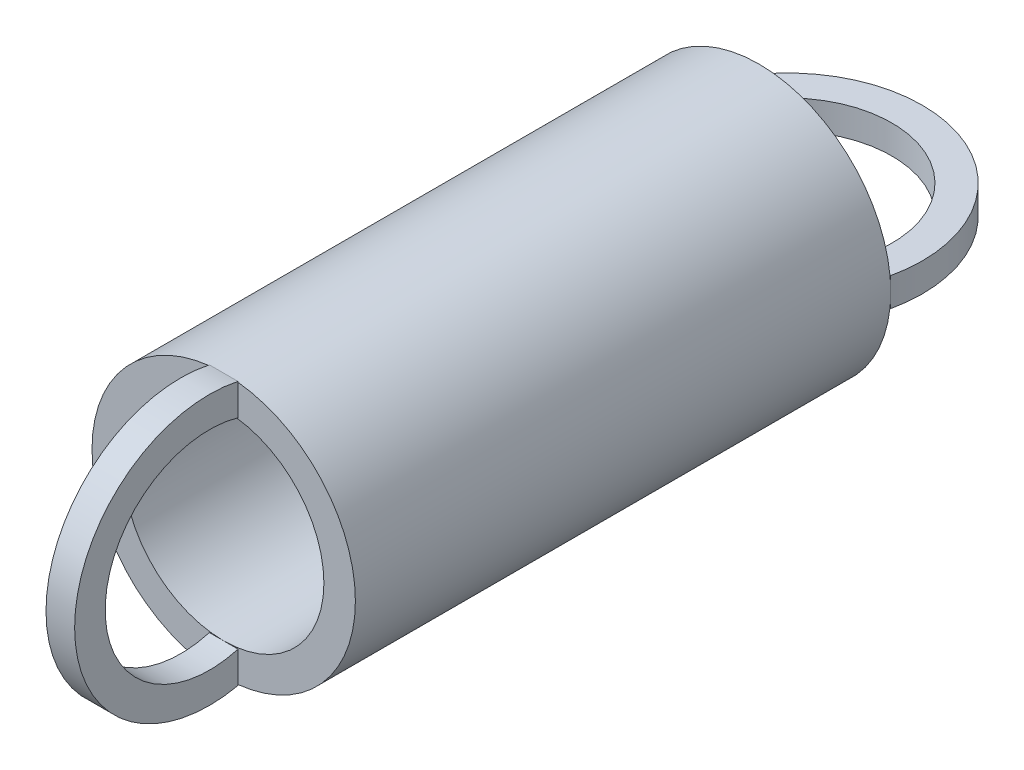
ISO-10303-21;
HEADER;
FILE_DESCRIPTION(('STEP AP214'),'2;1');
FILE_NAME('part.step','',(''),(''),'','','');
FILE_SCHEMA(('AUTOMOTIVE_DESIGN { 1 0 10303 214 1 1 1 1 }'));
ENDSEC;
DATA;
#1=APPLICATION_CONTEXT('core data for automotive mechanical design processes');
#2=APPLICATION_PROTOCOL_DEFINITION('international standard','automotive_design',2000,#1);
#3=PRODUCT_CONTEXT('',#1,'mechanical');
#4=PRODUCT('Part','Part','',(#3));
#5=PRODUCT_RELATED_PRODUCT_CATEGORY('part','',(#4));
#6=PRODUCT_DEFINITION_FORMATION('','',#4);
#7=PRODUCT_DEFINITION_CONTEXT('part definition',#1,'design');
#8=PRODUCT_DEFINITION('design','',#6,#7);
#9=PRODUCT_DEFINITION_SHAPE('','',#8);
#10=(LENGTH_UNIT() NAMED_UNIT(*) SI_UNIT(.MILLI.,.METRE.));
#11=(NAMED_UNIT(*) PLANE_ANGLE_UNIT() SI_UNIT($,.RADIAN.));
#12=(NAMED_UNIT(*) SI_UNIT($,.STERADIAN.) SOLID_ANGLE_UNIT());
#13=UNCERTAINTY_MEASURE_WITH_UNIT(LENGTH_MEASURE(1.E-05),#10,'distance_accuracy_value','');
#14=(GEOMETRIC_REPRESENTATION_CONTEXT(3) GLOBAL_UNCERTAINTY_ASSIGNED_CONTEXT((#13)) GLOBAL_UNIT_ASSIGNED_CONTEXT((#10,
#11,#12)) REPRESENTATION_CONTEXT('',''));
#15=CARTESIAN_POINT('',(0.,0.,0.));
#16=DIRECTION('',(0.,0.,1.));
#17=DIRECTION('',(1.,0.,0.));
#18=AXIS2_PLACEMENT_3D('',#15,#16,#17);
#19=CARTESIAN_POINT('',(0.,0.,-9.35));
#20=DIRECTION('',(0.,0.,1.));
#21=DIRECTION('',(1.,0.,0.));
#22=AXIS2_PLACEMENT_3D('',#19,#20,#21);
#23=PLANE('',#22);
#24=DIRECTION('',(1.,0.,0.));
#25=VECTOR('',#24,1.);
#26=CARTESIAN_POINT('',(-3.5,0.5,-9.35));
#27=LINE('',#26,#25);
#28=CARTESIAN_POINT('',(-4.57274534606947,0.5,-9.35));
#29=VERTEX_POINT('',#28);
#30=CARTESIAN_POINT('',(-3.5,0.5,-9.35));
#31=VERTEX_POINT('',#30);
#32=EDGE_CURVE('E164',#29,#31,#27,.T.);
#33=ORIENTED_EDGE('',*,*,#32,.F.);
#34=CARTESIAN_POINT('',(0.,0.,-9.35));
#35=DIRECTION('',(0.,0.,1.));
#36=DIRECTION('',(1.,0.,0.));
#37=AXIS2_PLACEMENT_3D('',#34,#35,#36);
#38=CIRCLE('',#37,4.6);
#39=CARTESIAN_POINT('',(4.57274534606947,0.5,-9.35));
#40=VERTEX_POINT('',#39);
#41=EDGE_CURVE('E183',#40,#29,#38,.T.);
#42=ORIENTED_EDGE('',*,*,#41,.F.);
#43=DIRECTION('',(1.,0.,0.));
#44=VECTOR('',#43,1.);
#45=CARTESIAN_POINT('',(4.6,0.5,-9.35));
#46=LINE('',#45,#44);
#47=CARTESIAN_POINT('',(3.5,0.5,-9.35));
#48=VERTEX_POINT('',#47);
#49=EDGE_CURVE('E160',#48,#40,#46,.T.);
#50=ORIENTED_EDGE('',*,*,#49,.F.);
#51=DIRECTION('',(0.,-1.,0.));
#52=VECTOR('',#51,1.);
#53=CARTESIAN_POINT('',(3.5,0.5,-9.35));
#54=LINE('',#53,#52);
#55=CARTESIAN_POINT('',(3.5,0.,-9.35));
#56=VERTEX_POINT('',#55);
#57=EDGE_CURVE('E171',#48,#56,#54,.T.);
#58=ORIENTED_EDGE('',*,*,#57,.T.);
#59=CARTESIAN_POINT('',(0.,0.,-9.35));
#60=DIRECTION('',(0.,0.,1.));
#61=DIRECTION('',(1.,0.,0.));
#62=AXIS2_PLACEMENT_3D('',#59,#60,#61);
#63=CIRCLE('',#62,3.5);
#64=CARTESIAN_POINT('',(-3.5,0.,-9.35));
#65=VERTEX_POINT('',#64);
#66=EDGE_CURVE('E298',#56,#65,#63,.T.);
#67=ORIENTED_EDGE('',*,*,#66,.T.);
#68=DIRECTION('',(0.,-1.,0.));
#69=VECTOR('',#68,1.);
#70=CARTESIAN_POINT('',(-3.5,0.5,-9.35));
#71=LINE('',#70,#69);
#72=EDGE_CURVE('E211',#31,#65,#71,.T.);
#73=ORIENTED_EDGE('',*,*,#72,.F.);
#74=EDGE_LOOP('',(#33,#42,#50,#58,#67,#73));
#75=FACE_BOUND('',#74,.T.);
#76=ADVANCED_FACE('F39',(#75),#23,.F.);
#77=CARTESIAN_POINT('',(-3.5,-0.5,-9.35));
#78=VERTEX_POINT('',#77);
#79=EDGE_CURVE('E195',#65,#78,#71,.T.);
#80=ORIENTED_EDGE('',*,*,#79,.F.);
#81=EDGE_CURVE('E291',#65,#56,#63,.T.);
#82=ORIENTED_EDGE('',*,*,#81,.T.);
#83=CARTESIAN_POINT('',(3.5,-0.5,-9.35));
#84=VERTEX_POINT('',#83);
#85=EDGE_CURVE('E175',#56,#84,#54,.T.);
#86=ORIENTED_EDGE('',*,*,#85,.T.);
#87=DIRECTION('',(1.,0.,0.));
#88=VECTOR('',#87,1.);
#89=CARTESIAN_POINT('',(4.6,-0.5,-9.35));
#90=LINE('',#89,#88);
#91=CARTESIAN_POINT('',(4.57274534606947,-0.5,-9.35));
#92=VERTEX_POINT('',#91);
#93=EDGE_CURVE('E200',#84,#92,#90,.T.);
#94=ORIENTED_EDGE('',*,*,#93,.T.);
#95=CARTESIAN_POINT('',(-4.57274534606947,-0.5,-9.35));
#96=VERTEX_POINT('',#95);
#97=EDGE_CURVE('E296',#96,#92,#38,.T.);
#98=ORIENTED_EDGE('',*,*,#97,.F.);
#99=DIRECTION('',(1.,0.,0.));
#100=VECTOR('',#99,1.);
#101=CARTESIAN_POINT('',(-3.5,-0.5,-9.35));
#102=LINE('',#101,#100);
#103=EDGE_CURVE('E208',#96,#78,#102,.T.);
#104=ORIENTED_EDGE('',*,*,#103,.T.);
#105=EDGE_LOOP('',(#80,#82,#86,#94,#98,#104));
#106=FACE_BOUND('',#105,.T.);
#107=ADVANCED_FACE('F307',(#106),#23,.F.);
#108=CARTESIAN_POINT('',(0.,0.,9.35));
#109=DIRECTION('',(0.,0.,1.));
#110=DIRECTION('',(1.,0.,0.));
#111=AXIS2_PLACEMENT_3D('',#108,#109,#110);
#112=PLANE('',#111);
#113=DIRECTION('',(0.,1.,0.));
#114=VECTOR('',#113,1.);
#115=CARTESIAN_POINT('',(-0.5,-4.6,9.35));
#116=LINE('',#115,#114);
#117=CARTESIAN_POINT('',(-0.5,-4.57274534606947,9.35));
#118=VERTEX_POINT('',#117);
#119=CARTESIAN_POINT('',(-0.5,-3.5,9.35));
#120=VERTEX_POINT('',#119);
#121=EDGE_CURVE('E260',#118,#120,#116,.T.);
#122=ORIENTED_EDGE('',*,*,#121,.T.);
#123=DIRECTION('',(-1.,0.,0.));
#124=VECTOR('',#123,1.);
#125=CARTESIAN_POINT('',(0.5,-3.5,9.35));
#126=LINE('',#125,#124);
#127=CARTESIAN_POINT('',(0.,-3.5,9.35));
#128=VERTEX_POINT('',#127);
#129=EDGE_CURVE('E247',#128,#120,#126,.T.);
#130=ORIENTED_EDGE('',*,*,#129,.F.);
#131=CARTESIAN_POINT('',(0.,0.,9.35));
#132=DIRECTION('',(0.,0.,1.));
#133=DIRECTION('',(1.,0.,0.));
#134=AXIS2_PLACEMENT_3D('',#131,#132,#133);
#135=CIRCLE('',#134,3.5);
#136=CARTESIAN_POINT('',(0.,3.5,9.35));
#137=VERTEX_POINT('',#136);
#138=EDGE_CURVE('E292',#137,#128,#135,.T.);
#139=ORIENTED_EDGE('',*,*,#138,.F.);
#140=DIRECTION('',(-1.,0.,0.));
#141=VECTOR('',#140,1.);
#142=CARTESIAN_POINT('',(0.5,3.5,9.35));
#143=LINE('',#142,#141);
#144=CARTESIAN_POINT('',(-0.5,3.5,9.35));
#145=VERTEX_POINT('',#144);
#146=EDGE_CURVE('E278',#137,#145,#143,.T.);
#147=ORIENTED_EDGE('',*,*,#146,.T.);
#148=DIRECTION('',(0.,1.,0.));
#149=VECTOR('',#148,1.);
#150=CARTESIAN_POINT('',(-0.5,4.6,9.35));
#151=LINE('',#150,#149);
#152=CARTESIAN_POINT('',(-0.5,4.57274534606947,9.35));
#153=VERTEX_POINT('',#152);
#154=EDGE_CURVE('E252',#145,#153,#151,.T.);
#155=ORIENTED_EDGE('',*,*,#154,.T.);
#156=CARTESIAN_POINT('',(0.,0.,9.35));
#157=DIRECTION('',(0.,0.,1.));
#158=DIRECTION('',(1.,0.,0.));
#159=AXIS2_PLACEMENT_3D('',#156,#157,#158);
#160=CIRCLE('',#159,4.6);
#161=EDGE_CURVE('E49',#153,#118,#160,.T.);
#162=ORIENTED_EDGE('',*,*,#161,.T.);
#163=EDGE_LOOP('',(#122,#130,#139,#147,#155,#162));
#164=FACE_BOUND('',#163,.T.);
#165=ADVANCED_FACE('F333',(#164),#112,.T.);
#166=DIRECTION('',(0.,1.,0.));
#167=VECTOR('',#166,1.);
#168=CARTESIAN_POINT('',(0.5,-4.6,9.35));
#169=LINE('',#168,#167);
#170=CARTESIAN_POINT('',(0.5,-4.57274534606947,9.35));
#171=VERTEX_POINT('',#170);
#172=CARTESIAN_POINT('',(0.5,-3.5,9.35));
#173=VERTEX_POINT('',#172);
#174=EDGE_CURVE('E242',#171,#173,#169,.T.);
#175=ORIENTED_EDGE('',*,*,#174,.F.);
#176=CARTESIAN_POINT('',(0.5,4.57274534606947,9.35));
#177=VERTEX_POINT('',#176);
#178=EDGE_CURVE('E50',#171,#177,#160,.T.);
#179=ORIENTED_EDGE('',*,*,#178,.T.);
#180=DIRECTION('',(0.,1.,0.));
#181=VECTOR('',#180,1.);
#182=CARTESIAN_POINT('',(0.5,4.6,9.35));
#183=LINE('',#182,#181);
#184=CARTESIAN_POINT('',(0.5,3.5,9.35));
#185=VERTEX_POINT('',#184);
#186=EDGE_CURVE('E235',#185,#177,#183,.T.);
#187=ORIENTED_EDGE('',*,*,#186,.F.);
#188=EDGE_CURVE('E279',#185,#137,#143,.T.);
#189=ORIENTED_EDGE('',*,*,#188,.T.);
#190=EDGE_CURVE('E297',#128,#137,#135,.T.);
#191=ORIENTED_EDGE('',*,*,#190,.F.);
#192=EDGE_CURVE('E264',#173,#128,#126,.T.);
#193=ORIENTED_EDGE('',*,*,#192,.F.);
#194=EDGE_LOOP('',(#175,#179,#187,#189,#191,#193));
#195=FACE_BOUND('',#194,.T.);
#196=ADVANCED_FACE('F324',(#195),#112,.T.);
#197=CARTESIAN_POINT('',(0.,0.,9.35));
#198=DIRECTION('',(0.,0.,-1.));
#199=DIRECTION('',(-1.,0.,0.));
#200=AXIS2_PLACEMENT_3D('',#197,#198,#199);
#201=CYLINDRICAL_SURFACE('',#200,4.6);
#202=CARTESIAN_POINT('',(0.,4.6,9.35));
#203=VERTEX_POINT('',#202);
#204=EDGE_CURVE('E11',#177,#203,#160,.T.);
#205=ORIENTED_EDGE('',*,*,#204,.F.);
#206=ORIENTED_EDGE('',*,*,#178,.F.);
#207=CARTESIAN_POINT('',(0.,0.,9.35));
#208=DIRECTION('',(0.,0.,1.));
#209=DIRECTION('',(1.,0.,0.));
#210=AXIS2_PLACEMENT_3D('',#207,#208,#209);
#211=CIRCLE('',#210,4.6);
#212=CARTESIAN_POINT('',(0.,-4.6,9.35));
#213=VERTEX_POINT('',#212);
#214=EDGE_CURVE('E282',#213,#171,#211,.T.);
#215=ORIENTED_EDGE('',*,*,#214,.F.);
#216=EDGE_CURVE('E286',#118,#213,#211,.T.);
#217=ORIENTED_EDGE('',*,*,#216,.F.);
#218=ORIENTED_EDGE('',*,*,#161,.F.);
#219=CARTESIAN_POINT('',(0.,0.,9.35));
#220=DIRECTION('',(0.,0.,1.));
#221=DIRECTION('',(1.,0.,0.));
#222=AXIS2_PLACEMENT_3D('',#219,#220,#221);
#223=CIRCLE('',#222,4.6);
#224=EDGE_CURVE('E287',#203,#153,#223,.T.);
#225=ORIENTED_EDGE('',*,*,#224,.F.);
#226=EDGE_LOOP('',(#205,#206,#215,#217,#218,#225));
#227=FACE_BOUND('',#226,.T.);
#228=CARTESIAN_POINT('',(4.6,0.,-9.35));
#229=VERTEX_POINT('',#228);
#230=EDGE_CURVE('E43',#229,#40,#38,.T.);
#231=ORIENTED_EDGE('',*,*,#230,.T.);
#232=ORIENTED_EDGE('',*,*,#41,.T.);
#233=CARTESIAN_POINT('',(0.,0.,-9.35));
#234=DIRECTION('',(0.,0.,-1.));
#235=DIRECTION('',(-1.,0.,0.));
#236=AXIS2_PLACEMENT_3D('',#233,#234,#235);
#237=CIRCLE('',#236,4.6);
#238=CARTESIAN_POINT('',(-4.6,0.,-9.35));
#239=VERTEX_POINT('',#238);
#240=EDGE_CURVE('E224',#239,#29,#237,.T.);
#241=ORIENTED_EDGE('',*,*,#240,.F.);
#242=EDGE_CURVE('E180',#96,#239,#237,.T.);
#243=ORIENTED_EDGE('',*,*,#242,.F.);
#244=ORIENTED_EDGE('',*,*,#97,.T.);
#245=CARTESIAN_POINT('',(0.,0.,-9.35));
#246=DIRECTION('',(0.,0.,-1.));
#247=DIRECTION('',(-1.,0.,0.));
#248=AXIS2_PLACEMENT_3D('',#245,#246,#247);
#249=CIRCLE('',#248,4.6);
#250=EDGE_CURVE('E225',#229,#92,#249,.T.);
#251=ORIENTED_EDGE('',*,*,#250,.F.);
#252=EDGE_LOOP('',(#231,#232,#241,#243,#244,#251));
#253=FACE_BOUND('',#252,.T.);
#254=ADVANCED_FACE('F41',(#227,#253),#201,.T.);
#255=CARTESIAN_POINT('',(0.,0.,9.35));
#256=DIRECTION('',(0.,0.,-1.));
#257=DIRECTION('',(-1.,0.,0.));
#258=AXIS2_PLACEMENT_3D('',#255,#256,#257);
#259=CYLINDRICAL_SURFACE('',#258,3.5);
#260=ORIENTED_EDGE('',*,*,#138,.T.);
#261=ORIENTED_EDGE('',*,*,#190,.T.);
#262=EDGE_LOOP('',(#260,#261));
#263=FACE_BOUND('',#262,.T.);
#264=ORIENTED_EDGE('',*,*,#66,.F.);
#265=ORIENTED_EDGE('',*,*,#81,.F.);
#266=EDGE_LOOP('',(#264,#265));
#267=FACE_BOUND('',#266,.T.);
#268=ADVANCED_FACE('F310',(#263,#267),#259,.F.);
#269=CARTESIAN_POINT('',(0.5,4.6,9.35));
#270=DIRECTION('',(0.,0.,1.));
#271=DIRECTION('',(1.,0.,0.));
#272=AXIS2_PLACEMENT_3D('',#269,#270,#271);
#273=PLANE('',#272);
#274=CARTESIAN_POINT('',(0.5,4.6,9.35));
#275=VERTEX_POINT('',#274);
#276=EDGE_CURVE('E233',#177,#275,#183,.T.);
#277=ORIENTED_EDGE('',*,*,#276,.F.);
#278=ORIENTED_EDGE('',*,*,#204,.T.);
#279=DIRECTION('',(-1.,0.,0.));
#280=VECTOR('',#279,1.);
#281=CARTESIAN_POINT('',(0.5,4.6,9.35));
#282=LINE('',#281,#280);
#283=EDGE_CURVE('E274',#275,#203,#282,.T.);
#284=ORIENTED_EDGE('',*,*,#283,.F.);
#285=EDGE_LOOP('',(#277,#278,#284));
#286=FACE_BOUND('',#285,.T.);
#287=ADVANCED_FACE('F312',(#286),#273,.F.);
#288=CARTESIAN_POINT('',(0.5,-4.6,9.35));
#289=DIRECTION('',(0.,0.,1.));
#290=DIRECTION('',(1.,0.,0.));
#291=AXIS2_PLACEMENT_3D('',#288,#289,#290);
#292=PLANE('',#291);
#293=CARTESIAN_POINT('',(-0.5,-4.6,9.35));
#294=VERTEX_POINT('',#293);
#295=EDGE_CURVE('E234',#294,#118,#116,.T.);
#296=ORIENTED_EDGE('',*,*,#295,.T.);
#297=ORIENTED_EDGE('',*,*,#216,.T.);
#298=DIRECTION('',(-1.,0.,0.));
#299=VECTOR('',#298,1.);
#300=CARTESIAN_POINT('',(0.5,-4.6,9.35));
#301=LINE('',#300,#299);
#302=EDGE_CURVE('E268',#213,#294,#301,.T.);
#303=ORIENTED_EDGE('',*,*,#302,.T.);
#304=EDGE_LOOP('',(#296,#297,#303));
#305=FACE_BOUND('',#304,.T.);
#306=ADVANCED_FACE('F320',(#305),#292,.F.);
#307=CARTESIAN_POINT('',(0.5,0.,10.35));
#308=DIRECTION('',(-1.,0.,0.));
#309=DIRECTION('',(0.,0.,1.));
#310=AXIS2_PLACEMENT_3D('',#307,#308,#309);
#311=CYLINDRICAL_SURFACE('',#310,3.64005494464026);
#312=CARTESIAN_POINT('',(-0.5,0.,10.35));
#313=DIRECTION('',(-1.,0.,0.));
#314=DIRECTION('',(0.,0.,-1.));
#315=AXIS2_PLACEMENT_3D('',#312,#313,#314);
#316=CIRCLE('',#315,3.64005494464026);
#317=EDGE_CURVE('E228',#120,#145,#316,.T.);
#318=ORIENTED_EDGE('',*,*,#317,.T.);
#319=ORIENTED_EDGE('',*,*,#146,.F.);
#320=ORIENTED_EDGE('',*,*,#188,.F.);
#321=CARTESIAN_POINT('',(0.5,0.,10.35));
#322=DIRECTION('',(-1.,0.,0.));
#323=DIRECTION('',(0.,0.,-1.));
#324=AXIS2_PLACEMENT_3D('',#321,#322,#323);
#325=CIRCLE('',#324,3.64005494464026);
#326=EDGE_CURVE('E229',#173,#185,#325,.T.);
#327=ORIENTED_EDGE('',*,*,#326,.F.);
#328=ORIENTED_EDGE('',*,*,#192,.T.);
#329=ORIENTED_EDGE('',*,*,#129,.T.);
#330=EDGE_LOOP('',(#318,#319,#320,#327,#328,#329));
#331=FACE_BOUND('',#330,.T.);
#332=ADVANCED_FACE('F418',(#331),#311,.F.);
#333=CARTESIAN_POINT('',(-0.5,4.6,9.35));
#334=VERTEX_POINT('',#333);
#335=EDGE_CURVE('E273',#203,#334,#282,.T.);
#336=ORIENTED_EDGE('',*,*,#335,.F.);
#337=ORIENTED_EDGE('',*,*,#224,.T.);
#338=EDGE_CURVE('E251',#153,#334,#151,.T.);
#339=ORIENTED_EDGE('',*,*,#338,.T.);
#340=EDGE_LOOP('',(#336,#337,#339));
#341=FACE_BOUND('',#340,.T.);
#342=ADVANCED_FACE('F323',(#341),#273,.F.);
#343=CARTESIAN_POINT('',(0.5,0.,10.35));
#344=DIRECTION('',(-1.,0.,0.));
#345=DIRECTION('',(0.,0.,1.));
#346=AXIS2_PLACEMENT_3D('',#343,#344,#345);
#347=CYLINDRICAL_SURFACE('',#346,4.70744091837593);
#348=CARTESIAN_POINT('',(-0.5,0.,10.35));
#349=DIRECTION('',(1.,0.,0.));
#350=DIRECTION('',(0.,0.,-1.));
#351=AXIS2_PLACEMENT_3D('',#348,#349,#350);
#352=CIRCLE('',#351,4.70744091837593);
#353=EDGE_CURVE('E256',#334,#294,#352,.T.);
#354=ORIENTED_EDGE('',*,*,#353,.T.);
#355=ORIENTED_EDGE('',*,*,#302,.F.);
#356=CARTESIAN_POINT('',(0.5,-4.6,9.35));
#357=VERTEX_POINT('',#356);
#358=EDGE_CURVE('E269',#357,#213,#301,.T.);
#359=ORIENTED_EDGE('',*,*,#358,.F.);
#360=CARTESIAN_POINT('',(0.5,0.,10.35));
#361=DIRECTION('',(1.,0.,0.));
#362=DIRECTION('',(0.,0.,-1.));
#363=AXIS2_PLACEMENT_3D('',#360,#361,#362);
#364=CIRCLE('',#363,4.70744091837593);
#365=EDGE_CURVE('E239',#275,#357,#364,.T.);
#366=ORIENTED_EDGE('',*,*,#365,.F.);
#367=ORIENTED_EDGE('',*,*,#283,.T.);
#368=ORIENTED_EDGE('',*,*,#335,.T.);
#369=EDGE_LOOP('',(#354,#355,#359,#366,#367,#368));
#370=FACE_BOUND('',#369,.T.);
#371=ADVANCED_FACE('F359',(#370),#347,.T.);
#372=ORIENTED_EDGE('',*,*,#358,.T.);
#373=ORIENTED_EDGE('',*,*,#214,.T.);
#374=EDGE_CURVE('E243',#357,#171,#169,.T.);
#375=ORIENTED_EDGE('',*,*,#374,.F.);
#376=EDGE_LOOP('',(#372,#373,#375));
#377=FACE_BOUND('',#376,.T.);
#378=ADVANCED_FACE('F350',(#377),#292,.F.);
#379=CARTESIAN_POINT('',(0.5,0.,10.35));
#380=DIRECTION('',(1.,0.,0.));
#381=DIRECTION('',(0.,0.,-1.));
#382=AXIS2_PLACEMENT_3D('',#379,#380,#381);
#383=PLANE('',#382);
#384=ORIENTED_EDGE('',*,*,#326,.T.);
#385=ORIENTED_EDGE('',*,*,#186,.T.);
#386=ORIENTED_EDGE('',*,*,#276,.T.);
#387=ORIENTED_EDGE('',*,*,#365,.T.);
#388=ORIENTED_EDGE('',*,*,#374,.T.);
#389=ORIENTED_EDGE('',*,*,#174,.T.);
#390=EDGE_LOOP('',(#384,#385,#386,#387,#388,#389));
#391=FACE_BOUND('',#390,.T.);
#392=ADVANCED_FACE('F353',(#391),#383,.T.);
#393=CARTESIAN_POINT('',(-0.5,0.,10.35));
#394=DIRECTION('',(1.,0.,0.));
#395=DIRECTION('',(0.,0.,-1.));
#396=AXIS2_PLACEMENT_3D('',#393,#394,#395);
#397=PLANE('',#396);
#398=ORIENTED_EDGE('',*,*,#317,.F.);
#399=ORIENTED_EDGE('',*,*,#121,.F.);
#400=ORIENTED_EDGE('',*,*,#295,.F.);
#401=ORIENTED_EDGE('',*,*,#353,.F.);
#402=ORIENTED_EDGE('',*,*,#338,.F.);
#403=ORIENTED_EDGE('',*,*,#154,.F.);
#404=EDGE_LOOP('',(#398,#399,#400,#401,#402,#403));
#405=FACE_BOUND('',#404,.T.);
#406=ADVANCED_FACE('F410',(#405),#397,.F.);
#407=CARTESIAN_POINT('',(4.6,0.5,-9.35));
#408=DIRECTION('',(0.,0.,-1.));
#409=DIRECTION('',(-1.,0.,0.));
#410=AXIS2_PLACEMENT_3D('',#407,#408,#409);
#411=PLANE('',#410);
#412=CARTESIAN_POINT('',(4.6,0.5,-9.35));
#413=VERTEX_POINT('',#412);
#414=EDGE_CURVE('E168',#40,#413,#46,.T.);
#415=ORIENTED_EDGE('',*,*,#414,.F.);
#416=ORIENTED_EDGE('',*,*,#230,.F.);
#417=DIRECTION('',(0.,-1.,0.));
#418=VECTOR('',#417,1.);
#419=CARTESIAN_POINT('',(4.6,0.5,-9.35));
#420=LINE('',#419,#418);
#421=EDGE_CURVE('E65',#413,#229,#420,.T.);
#422=ORIENTED_EDGE('',*,*,#421,.F.);
#423=EDGE_LOOP('',(#415,#416,#422));
#424=FACE_BOUND('',#423,.T.);
#425=ADVANCED_FACE('F433',(#424),#411,.F.);
#426=CARTESIAN_POINT('',(-3.5,0.5,-9.35));
#427=DIRECTION('',(0.,0.,-1.));
#428=DIRECTION('',(-1.,0.,0.));
#429=AXIS2_PLACEMENT_3D('',#426,#427,#428);
#430=PLANE('',#429);
#431=DIRECTION('',(0.,-1.,0.));
#432=VECTOR('',#431,1.);
#433=CARTESIAN_POINT('',(-4.6,0.5,-9.35));
#434=LINE('',#433,#432);
#435=CARTESIAN_POINT('',(-4.6,0.5,-9.35));
#436=VERTEX_POINT('',#435);
#437=EDGE_CURVE('E215',#436,#239,#434,.T.);
#438=ORIENTED_EDGE('',*,*,#437,.T.);
#439=ORIENTED_EDGE('',*,*,#240,.T.);
#440=EDGE_CURVE('E192',#436,#29,#27,.T.);
#441=ORIENTED_EDGE('',*,*,#440,.F.);
#442=EDGE_LOOP('',(#438,#439,#441));
#443=FACE_BOUND('',#442,.T.);
#444=ADVANCED_FACE('F398',(#443),#430,.F.);
#445=CARTESIAN_POINT('',(0.,0.5,-10.35));
#446=DIRECTION('',(0.,-1.,0.));
#447=DIRECTION('',(0.,0.,-1.));
#448=AXIS2_PLACEMENT_3D('',#445,#446,#447);
#449=CYLINDRICAL_SURFACE('',#448,3.64005494464026);
#450=CARTESIAN_POINT('',(0.,-0.5,-10.35));
#451=DIRECTION('',(0.,-1.,0.));
#452=DIRECTION('',(0.,0.,-1.));
#453=AXIS2_PLACEMENT_3D('',#450,#451,#452);
#454=CIRCLE('',#453,3.64005494464026);
#455=EDGE_CURVE('E196',#78,#84,#454,.T.);
#456=ORIENTED_EDGE('',*,*,#455,.T.);
#457=ORIENTED_EDGE('',*,*,#85,.F.);
#458=ORIENTED_EDGE('',*,*,#57,.F.);
#459=CARTESIAN_POINT('',(0.,0.5,-10.35));
#460=DIRECTION('',(0.,-1.,0.));
#461=DIRECTION('',(0.,0.,-1.));
#462=AXIS2_PLACEMENT_3D('',#459,#460,#461);
#463=CIRCLE('',#462,3.64005494464026);
#464=EDGE_CURVE('E156',#31,#48,#463,.T.);
#465=ORIENTED_EDGE('',*,*,#464,.F.);
#466=ORIENTED_EDGE('',*,*,#72,.T.);
#467=ORIENTED_EDGE('',*,*,#79,.T.);
#468=EDGE_LOOP('',(#456,#457,#458,#465,#466,#467));
#469=FACE_BOUND('',#468,.T.);
#470=ADVANCED_FACE('F173',(#469),#449,.F.);
#471=CARTESIAN_POINT('',(4.6,-0.5,-9.35));
#472=VERTEX_POINT('',#471);
#473=EDGE_CURVE('E219',#229,#472,#420,.T.);
#474=ORIENTED_EDGE('',*,*,#473,.F.);
#475=ORIENTED_EDGE('',*,*,#250,.T.);
#476=EDGE_CURVE('E199',#92,#472,#90,.T.);
#477=ORIENTED_EDGE('',*,*,#476,.T.);
#478=EDGE_LOOP('',(#474,#475,#477));
#479=FACE_BOUND('',#478,.T.);
#480=ADVANCED_FACE('F389',(#479),#411,.F.);
#481=CARTESIAN_POINT('',(0.,0.5,-10.35));
#482=DIRECTION('',(0.,-1.,0.));
#483=DIRECTION('',(0.,0.,-1.));
#484=AXIS2_PLACEMENT_3D('',#481,#482,#483);
#485=CYLINDRICAL_SURFACE('',#484,4.70744091837593);
#486=CARTESIAN_POINT('',(0.,-0.5,-10.35));
#487=DIRECTION('',(0.,1.,0.));
#488=DIRECTION('',(0.,0.,1.));
#489=AXIS2_PLACEMENT_3D('',#486,#487,#488);
#490=CIRCLE('',#489,4.70744091837593);
#491=CARTESIAN_POINT('',(-4.6,-0.5,-9.35));
#492=VERTEX_POINT('',#491);
#493=EDGE_CURVE('E204',#472,#492,#490,.T.);
#494=ORIENTED_EDGE('',*,*,#493,.T.);
#495=EDGE_CURVE('E214',#239,#492,#434,.T.);
#496=ORIENTED_EDGE('',*,*,#495,.F.);
#497=ORIENTED_EDGE('',*,*,#437,.F.);
#498=CARTESIAN_POINT('',(0.,0.5,-10.35));
#499=DIRECTION('',(0.,1.,0.));
#500=DIRECTION('',(0.,0.,1.));
#501=AXIS2_PLACEMENT_3D('',#498,#499,#500);
#502=CIRCLE('',#501,4.70744091837593);
#503=EDGE_CURVE('E186',#413,#436,#502,.T.);
#504=ORIENTED_EDGE('',*,*,#503,.F.);
#505=ORIENTED_EDGE('',*,*,#421,.T.);
#506=ORIENTED_EDGE('',*,*,#473,.T.);
#507=EDGE_LOOP('',(#494,#496,#497,#504,#505,#506));
#508=FACE_BOUND('',#507,.T.);
#509=ADVANCED_FACE('F393',(#508),#485,.T.);
#510=EDGE_CURVE('E57',#492,#96,#102,.T.);
#511=ORIENTED_EDGE('',*,*,#510,.T.);
#512=ORIENTED_EDGE('',*,*,#242,.T.);
#513=ORIENTED_EDGE('',*,*,#495,.T.);
#514=EDGE_LOOP('',(#511,#512,#513));
#515=FACE_BOUND('',#514,.T.);
#516=ADVANCED_FACE('F442',(#515),#430,.F.);
#517=CARTESIAN_POINT('',(0.,0.5,-10.35));
#518=DIRECTION('',(0.,-1.,0.));
#519=DIRECTION('',(0.,0.,-1.));
#520=AXIS2_PLACEMENT_3D('',#517,#518,#519);
#521=PLANE('',#520);
#522=ORIENTED_EDGE('',*,*,#464,.T.);
#523=ORIENTED_EDGE('',*,*,#49,.T.);
#524=ORIENTED_EDGE('',*,*,#414,.T.);
#525=ORIENTED_EDGE('',*,*,#503,.T.);
#526=ORIENTED_EDGE('',*,*,#440,.T.);
#527=ORIENTED_EDGE('',*,*,#32,.T.);
#528=EDGE_LOOP('',(#522,#523,#524,#525,#526,#527));
#529=FACE_BOUND('',#528,.T.);
#530=ADVANCED_FACE('F158',(#529),#521,.F.);
#531=CARTESIAN_POINT('',(0.,-0.5,-10.35));
#532=DIRECTION('',(0.,-1.,0.));
#533=DIRECTION('',(0.,0.,-1.));
#534=AXIS2_PLACEMENT_3D('',#531,#532,#533);
#535=PLANE('',#534);
#536=ORIENTED_EDGE('',*,*,#455,.F.);
#537=ORIENTED_EDGE('',*,*,#103,.F.);
#538=ORIENTED_EDGE('',*,*,#510,.F.);
#539=ORIENTED_EDGE('',*,*,#493,.F.);
#540=ORIENTED_EDGE('',*,*,#476,.F.);
#541=ORIENTED_EDGE('',*,*,#93,.F.);
#542=EDGE_LOOP('',(#536,#537,#538,#539,#540,#541));
#543=FACE_BOUND('',#542,.T.);
#544=ADVANCED_FACE('F379',(#543),#535,.T.);
#545=CLOSED_SHELL('',(#76,#107,#165,#196,#254,#268,#287,#306,#332,#342,#371,#378,#392,#406,#425,
#444,#470,#480,#509,#516,#530,#544));
#546=MANIFOLD_SOLID_BREP('B2',#545);
#547=ADVANCED_BREP_SHAPE_REPRESENTATION('',(#18,#546),#14);
#548=SHAPE_DEFINITION_REPRESENTATION(#9,#547);
ENDSEC;
END-ISO-10303-21;
